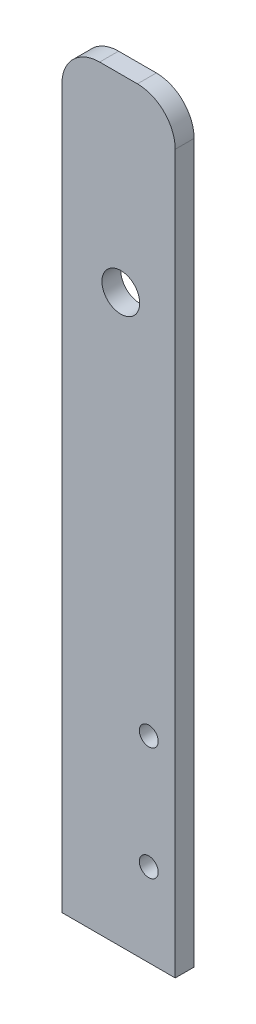
ISO-10303-21;
HEADER;
FILE_DESCRIPTION(('STEP AP214'),'2;1');
FILE_NAME('part.step','',(''),(''),'','','');
FILE_SCHEMA(('AUTOMOTIVE_DESIGN { 1 0 10303 214 1 1 1 1 }'));
ENDSEC;
DATA;
#1=APPLICATION_CONTEXT('core data for automotive mechanical design processes');
#2=APPLICATION_PROTOCOL_DEFINITION('international standard','automotive_design',2000,#1);
#3=PRODUCT_CONTEXT('',#1,'mechanical');
#4=PRODUCT('Part','Part','',(#3));
#5=PRODUCT_RELATED_PRODUCT_CATEGORY('part','',(#4));
#6=PRODUCT_DEFINITION_FORMATION('','',#4);
#7=PRODUCT_DEFINITION_CONTEXT('part definition',#1,'design');
#8=PRODUCT_DEFINITION('design','',#6,#7);
#9=PRODUCT_DEFINITION_SHAPE('','',#8);
#10=(LENGTH_UNIT() NAMED_UNIT(*) SI_UNIT(.MILLI.,.METRE.));
#11=(NAMED_UNIT(*) PLANE_ANGLE_UNIT() SI_UNIT($,.RADIAN.));
#12=(NAMED_UNIT(*) SI_UNIT($,.STERADIAN.) SOLID_ANGLE_UNIT());
#13=UNCERTAINTY_MEASURE_WITH_UNIT(LENGTH_MEASURE(1.E-05),#10,'distance_accuracy_value','');
#14=(GEOMETRIC_REPRESENTATION_CONTEXT(3) GLOBAL_UNCERTAINTY_ASSIGNED_CONTEXT((#13)) GLOBAL_UNIT_ASSIGNED_CONTEXT((#10,
#11,#12)) REPRESENTATION_CONTEXT('',''));
#15=CARTESIAN_POINT('',(0.,0.,0.));
#16=DIRECTION('',(0.,0.,1.));
#17=DIRECTION('',(1.,0.,0.));
#18=AXIS2_PLACEMENT_3D('',#15,#16,#17);
#19=CARTESIAN_POINT('',(0.,254.,6.35));
#20=DIRECTION('',(1.,0.,0.));
#21=DIRECTION('',(0.,1.,0.));
#22=AXIS2_PLACEMENT_3D('',#19,#20,#21);
#23=PLANE('',#22);
#24=DIRECTION('',(0.,-1.,0.));
#25=VECTOR('',#24,1.);
#26=CARTESIAN_POINT('',(0.,254.,6.35));
#27=LINE('',#26,#25);
#28=CARTESIAN_POINT('',(0.,241.3,6.35));
#29=VERTEX_POINT('',#28);
#30=CARTESIAN_POINT('',(0.,0.,6.35));
#31=VERTEX_POINT('',#30);
#32=EDGE_CURVE('E95',#29,#31,#27,.T.);
#33=ORIENTED_EDGE('',*,*,#32,.F.);
#34=DIRECTION('',(0.,0.,-1.));
#35=VECTOR('',#34,1.);
#36=CARTESIAN_POINT('',(0.,241.3,6.35));
#37=LINE('',#36,#35);
#38=CARTESIAN_POINT('',(0.,241.3,0.));
#39=VERTEX_POINT('',#38);
#40=EDGE_CURVE('E142',#29,#39,#37,.T.);
#41=ORIENTED_EDGE('',*,*,#40,.T.);
#42=DIRECTION('',(0.,-1.,0.));
#43=VECTOR('',#42,1.);
#44=CARTESIAN_POINT('',(0.,254.,0.));
#45=LINE('',#44,#43);
#46=CARTESIAN_POINT('',(0.,0.,0.));
#47=VERTEX_POINT('',#46);
#48=EDGE_CURVE('E119',#39,#47,#45,.T.);
#49=ORIENTED_EDGE('',*,*,#48,.T.);
#50=DIRECTION('',(0.,0.,-1.));
#51=VECTOR('',#50,1.);
#52=CARTESIAN_POINT('',(0.,0.,6.35));
#53=LINE('',#52,#51);
#54=EDGE_CURVE('E112',#31,#47,#53,.T.);
#55=ORIENTED_EDGE('',*,*,#54,.F.);
#56=EDGE_LOOP('',(#33,#41,#49,#55));
#57=FACE_BOUND('',#56,.T.);
#58=ADVANCED_FACE('F42',(#57),#23,.F.);
#59=CARTESIAN_POINT('',(0.,0.,6.35));
#60=DIRECTION('',(0.,1.,0.));
#61=DIRECTION('',(0.,0.,1.));
#62=AXIS2_PLACEMENT_3D('',#59,#60,#61);
#63=PLANE('',#62);
#64=DIRECTION('',(1.,0.,0.));
#65=VECTOR('',#64,1.);
#66=CARTESIAN_POINT('',(0.,0.,0.));
#67=LINE('',#66,#65);
#68=CARTESIAN_POINT('',(38.1,0.,0.));
#69=VERTEX_POINT('',#68);
#70=EDGE_CURVE('E158',#47,#69,#67,.T.);
#71=ORIENTED_EDGE('',*,*,#70,.T.);
#72=DIRECTION('',(0.,0.,-1.));
#73=VECTOR('',#72,1.);
#74=CARTESIAN_POINT('',(38.1,0.,6.35));
#75=LINE('',#74,#73);
#76=CARTESIAN_POINT('',(38.1,0.,6.35));
#77=VERTEX_POINT('',#76);
#78=EDGE_CURVE('E114',#77,#69,#75,.T.);
#79=ORIENTED_EDGE('',*,*,#78,.F.);
#80=DIRECTION('',(1.,0.,0.));
#81=VECTOR('',#80,1.);
#82=CARTESIAN_POINT('',(0.,0.,6.35));
#83=LINE('',#82,#81);
#84=EDGE_CURVE('E99',#31,#77,#83,.T.);
#85=ORIENTED_EDGE('',*,*,#84,.F.);
#86=ORIENTED_EDGE('',*,*,#54,.T.);
#87=EDGE_LOOP('',(#71,#79,#85,#86));
#88=FACE_BOUND('',#87,.T.);
#89=ADVANCED_FACE('F111',(#88),#63,.F.);
#90=CARTESIAN_POINT('',(38.1,254.,6.35));
#91=DIRECTION('',(-1.,0.,0.));
#92=DIRECTION('',(0.,0.,1.));
#93=AXIS2_PLACEMENT_3D('',#90,#91,#92);
#94=PLANE('',#93);
#95=DIRECTION('',(0.,1.,0.));
#96=VECTOR('',#95,1.);
#97=CARTESIAN_POINT('',(38.1,254.,0.));
#98=LINE('',#97,#96);
#99=CARTESIAN_POINT('',(38.1,241.3,0.));
#100=VERTEX_POINT('',#99);
#101=EDGE_CURVE('E165',#69,#100,#98,.T.);
#102=ORIENTED_EDGE('',*,*,#101,.T.);
#103=DIRECTION('',(0.,0.,-1.));
#104=VECTOR('',#103,1.);
#105=CARTESIAN_POINT('',(38.1,241.3,6.35));
#106=LINE('',#105,#104);
#107=CARTESIAN_POINT('',(38.1,241.3,6.35));
#108=VERTEX_POINT('',#107);
#109=EDGE_CURVE('E136',#100,#108,#106,.F.);
#110=ORIENTED_EDGE('',*,*,#109,.T.);
#111=DIRECTION('',(0.,1.,0.));
#112=VECTOR('',#111,1.);
#113=CARTESIAN_POINT('',(38.1,254.,6.35));
#114=LINE('',#113,#112);
#115=EDGE_CURVE('E117',#77,#108,#114,.T.);
#116=ORIENTED_EDGE('',*,*,#115,.F.);
#117=ORIENTED_EDGE('',*,*,#78,.T.);
#118=EDGE_LOOP('',(#102,#110,#116,#117));
#119=FACE_BOUND('',#118,.T.);
#120=ADVANCED_FACE('F195',(#119),#94,.F.);
#121=CARTESIAN_POINT('',(0.,254.,6.35));
#122=DIRECTION('',(0.,-1.,0.));
#123=DIRECTION('',(0.,0.,-1.));
#124=AXIS2_PLACEMENT_3D('',#121,#122,#123);
#125=PLANE('',#124);
#126=DIRECTION('',(-1.,0.,0.));
#127=VECTOR('',#126,1.);
#128=CARTESIAN_POINT('',(0.,254.,0.));
#129=LINE('',#128,#127);
#130=CARTESIAN_POINT('',(25.4,254.,0.));
#131=VERTEX_POINT('',#130);
#132=CARTESIAN_POINT('',(12.6999999999999,254.,0.));
#133=VERTEX_POINT('',#132);
#134=EDGE_CURVE('E107',#131,#133,#129,.T.);
#135=ORIENTED_EDGE('',*,*,#134,.T.);
#136=DIRECTION('',(0.,0.,-1.));
#137=VECTOR('',#136,1.);
#138=CARTESIAN_POINT('',(12.6999999999999,254.,6.35));
#139=LINE('',#138,#137);
#140=CARTESIAN_POINT('',(12.6999999999999,254.,6.35));
#141=VERTEX_POINT('',#140);
#142=EDGE_CURVE('E51',#133,#141,#139,.F.);
#143=ORIENTED_EDGE('',*,*,#142,.T.);
#144=DIRECTION('',(-1.,0.,0.));
#145=VECTOR('',#144,1.);
#146=CARTESIAN_POINT('',(0.,254.,6.35));
#147=LINE('',#146,#145);
#148=CARTESIAN_POINT('',(25.4,254.,6.35));
#149=VERTEX_POINT('',#148);
#150=EDGE_CURVE('E130',#149,#141,#147,.T.);
#151=ORIENTED_EDGE('',*,*,#150,.F.);
#152=DIRECTION('',(0.,0.,-1.));
#153=VECTOR('',#152,1.);
#154=CARTESIAN_POINT('',(25.4,254.,6.35));
#155=LINE('',#154,#153);
#156=EDGE_CURVE('E122',#149,#131,#155,.T.);
#157=ORIENTED_EDGE('',*,*,#156,.T.);
#158=EDGE_LOOP('',(#135,#143,#151,#157));
#159=FACE_BOUND('',#158,.T.);
#160=ADVANCED_FACE('F177',(#159),#125,.F.);
#161=CARTESIAN_POINT('',(0.,0.,6.35));
#162=DIRECTION('',(0.,0.,1.));
#163=DIRECTION('',(1.,0.,0.));
#164=AXIS2_PLACEMENT_3D('',#161,#162,#163);
#165=PLANE('',#164);
#166=CARTESIAN_POINT('',(29.21,27.94,6.35));
#167=DIRECTION('',(0.,0.,1.));
#168=DIRECTION('',(1.,0.,0.));
#169=AXIS2_PLACEMENT_3D('',#166,#167,#168);
#170=CIRCLE('',#169,3.175);
#171=CARTESIAN_POINT('',(32.385,27.94,6.35));
#172=VERTEX_POINT('',#171);
#173=EDGE_CURVE('E168',#172,#172,#170,.T.);
#174=ORIENTED_EDGE('',*,*,#173,.F.);
#175=EDGE_LOOP('',(#174));
#176=FACE_BOUND('',#175,.T.);
#177=CARTESIAN_POINT('',(29.21,66.04,6.35));
#178=DIRECTION('',(0.,0.,1.));
#179=DIRECTION('',(1.,0.,0.));
#180=AXIS2_PLACEMENT_3D('',#177,#178,#179);
#181=CIRCLE('',#180,3.175);
#182=CARTESIAN_POINT('',(32.385,66.04,6.35));
#183=VERTEX_POINT('',#182);
#184=EDGE_CURVE('E227',#183,#183,#181,.T.);
#185=ORIENTED_EDGE('',*,*,#184,.F.);
#186=EDGE_LOOP('',(#185));
#187=FACE_BOUND('',#186,.T.);
#188=CARTESIAN_POINT('',(19.812,190.5,6.35));
#189=DIRECTION('',(0.,0.,1.));
#190=DIRECTION('',(1.,0.,0.));
#191=AXIS2_PLACEMENT_3D('',#188,#189,#190);
#192=CIRCLE('',#191,6.35);
#193=CARTESIAN_POINT('',(26.162,190.5,6.35));
#194=VERTEX_POINT('',#193);
#195=EDGE_CURVE('E237',#194,#194,#192,.T.);
#196=ORIENTED_EDGE('',*,*,#195,.F.);
#197=EDGE_LOOP('',(#196));
#198=FACE_BOUND('',#197,.T.);
#199=ORIENTED_EDGE('',*,*,#150,.T.);
#200=CARTESIAN_POINT('',(12.6999999999999,241.3,6.35));
#201=DIRECTION('',(0.,0.,1.));
#202=DIRECTION('',(1.,0.,0.));
#203=AXIS2_PLACEMENT_3D('',#200,#201,#202);
#204=CIRCLE('',#203,12.7);
#205=EDGE_CURVE('E11',#141,#29,#204,.T.);
#206=ORIENTED_EDGE('',*,*,#205,.T.);
#207=ORIENTED_EDGE('',*,*,#32,.T.);
#208=ORIENTED_EDGE('',*,*,#84,.T.);
#209=ORIENTED_EDGE('',*,*,#115,.T.);
#210=CARTESIAN_POINT('',(25.4,241.3,6.35));
#211=DIRECTION('',(0.,0.,1.));
#212=DIRECTION('',(1.,0.,0.));
#213=AXIS2_PLACEMENT_3D('',#210,#211,#212);
#214=CIRCLE('',#213,12.7);
#215=EDGE_CURVE('E139',#108,#149,#214,.T.);
#216=ORIENTED_EDGE('',*,*,#215,.T.);
#217=EDGE_LOOP('',(#199,#206,#207,#208,#209,#216));
#218=FACE_BOUND('',#217,.T.);
#219=ADVANCED_FACE('F97',(#176,#187,#198,#218),#165,.T.);
#220=CARTESIAN_POINT('',(0.,0.,0.));
#221=DIRECTION('',(0.,0.,1.));
#222=DIRECTION('',(1.,0.,0.));
#223=AXIS2_PLACEMENT_3D('',#220,#221,#222);
#224=PLANE('',#223);
#225=CARTESIAN_POINT('',(29.21,27.94,0.));
#226=DIRECTION('',(0.,0.,1.));
#227=DIRECTION('',(1.,0.,0.));
#228=AXIS2_PLACEMENT_3D('',#225,#226,#227);
#229=CIRCLE('',#228,3.175);
#230=CARTESIAN_POINT('',(32.385,27.94,0.));
#231=VERTEX_POINT('',#230);
#232=EDGE_CURVE('E160',#231,#231,#229,.T.);
#233=ORIENTED_EDGE('',*,*,#232,.T.);
#234=EDGE_LOOP('',(#233));
#235=FACE_BOUND('',#234,.T.);
#236=CARTESIAN_POINT('',(29.21,66.04,0.));
#237=DIRECTION('',(0.,0.,1.));
#238=DIRECTION('',(1.,0.,0.));
#239=AXIS2_PLACEMENT_3D('',#236,#237,#238);
#240=CIRCLE('',#239,3.175);
#241=CARTESIAN_POINT('',(32.385,66.04,0.));
#242=VERTEX_POINT('',#241);
#243=EDGE_CURVE('E222',#242,#242,#240,.T.);
#244=ORIENTED_EDGE('',*,*,#243,.T.);
#245=EDGE_LOOP('',(#244));
#246=FACE_BOUND('',#245,.T.);
#247=CARTESIAN_POINT('',(19.812,190.5,0.));
#248=DIRECTION('',(0.,0.,1.));
#249=DIRECTION('',(1.,0.,0.));
#250=AXIS2_PLACEMENT_3D('',#247,#248,#249);
#251=CIRCLE('',#250,6.35);
#252=CARTESIAN_POINT('',(26.162,190.5,0.));
#253=VERTEX_POINT('',#252);
#254=EDGE_CURVE('E233',#253,#253,#251,.T.);
#255=ORIENTED_EDGE('',*,*,#254,.T.);
#256=EDGE_LOOP('',(#255));
#257=FACE_BOUND('',#256,.T.);
#258=ORIENTED_EDGE('',*,*,#48,.F.);
#259=CARTESIAN_POINT('',(12.6999999999999,241.3,0.));
#260=DIRECTION('',(0.,0.,1.));
#261=DIRECTION('',(1.,0.,0.));
#262=AXIS2_PLACEMENT_3D('',#259,#260,#261);
#263=CIRCLE('',#262,12.7);
#264=EDGE_CURVE('E65',#39,#133,#263,.F.);
#265=ORIENTED_EDGE('',*,*,#264,.T.);
#266=ORIENTED_EDGE('',*,*,#134,.F.);
#267=CARTESIAN_POINT('',(25.4,241.3,0.));
#268=DIRECTION('',(0.,0.,1.));
#269=DIRECTION('',(1.,0.,0.));
#270=AXIS2_PLACEMENT_3D('',#267,#268,#269);
#271=CIRCLE('',#270,12.7);
#272=EDGE_CURVE('E128',#131,#100,#271,.F.);
#273=ORIENTED_EDGE('',*,*,#272,.T.);
#274=ORIENTED_EDGE('',*,*,#101,.F.);
#275=ORIENTED_EDGE('',*,*,#70,.F.);
#276=EDGE_LOOP('',(#258,#265,#266,#273,#274,#275));
#277=FACE_BOUND('',#276,.T.);
#278=ADVANCED_FACE('F156',(#235,#246,#257,#277),#224,.F.);
#279=CARTESIAN_POINT('',(25.4,241.3,6.35));
#280=DIRECTION('',(0.,0.,-1.));
#281=DIRECTION('',(-1.,0.,0.));
#282=AXIS2_PLACEMENT_3D('',#279,#280,#281);
#283=CYLINDRICAL_SURFACE('',#282,12.7);
#284=ORIENTED_EDGE('',*,*,#215,.F.);
#285=ORIENTED_EDGE('',*,*,#109,.F.);
#286=ORIENTED_EDGE('',*,*,#272,.F.);
#287=ORIENTED_EDGE('',*,*,#156,.F.);
#288=EDGE_LOOP('',(#284,#285,#286,#287));
#289=FACE_BOUND('',#288,.T.);
#290=ADVANCED_FACE('F181',(#289),#283,.T.);
#291=CARTESIAN_POINT('',(12.6999999999999,241.3,6.35));
#292=DIRECTION('',(0.,0.,-1.));
#293=DIRECTION('',(-1.,0.,0.));
#294=AXIS2_PLACEMENT_3D('',#291,#292,#293);
#295=CYLINDRICAL_SURFACE('',#294,12.7);
#296=ORIENTED_EDGE('',*,*,#205,.F.);
#297=ORIENTED_EDGE('',*,*,#142,.F.);
#298=ORIENTED_EDGE('',*,*,#264,.F.);
#299=ORIENTED_EDGE('',*,*,#40,.F.);
#300=EDGE_LOOP('',(#296,#297,#298,#299));
#301=FACE_BOUND('',#300,.T.);
#302=ADVANCED_FACE('F44',(#301),#295,.T.);
#303=CARTESIAN_POINT('',(19.812,190.5,0.));
#304=DIRECTION('',(0.,0.,1.));
#305=DIRECTION('',(1.,0.,0.));
#306=AXIS2_PLACEMENT_3D('',#303,#304,#305);
#307=CYLINDRICAL_SURFACE('',#306,6.35);
#308=ORIENTED_EDGE('',*,*,#254,.F.);
#309=EDGE_LOOP('',(#308));
#310=FACE_BOUND('',#309,.T.);
#311=ORIENTED_EDGE('',*,*,#195,.T.);
#312=EDGE_LOOP('',(#311));
#313=FACE_BOUND('',#312,.T.);
#314=ADVANCED_FACE('F180',(#310,#313),#307,.F.);
#315=CARTESIAN_POINT('',(29.21,66.04,0.));
#316=DIRECTION('',(0.,0.,1.));
#317=DIRECTION('',(1.,0.,0.));
#318=AXIS2_PLACEMENT_3D('',#315,#316,#317);
#319=CYLINDRICAL_SURFACE('',#318,3.175);
#320=ORIENTED_EDGE('',*,*,#243,.F.);
#321=EDGE_LOOP('',(#320));
#322=FACE_BOUND('',#321,.T.);
#323=ORIENTED_EDGE('',*,*,#184,.T.);
#324=EDGE_LOOP('',(#323));
#325=FACE_BOUND('',#324,.T.);
#326=ADVANCED_FACE('F186',(#322,#325),#319,.F.);
#327=CARTESIAN_POINT('',(29.21,27.94,0.));
#328=DIRECTION('',(0.,0.,1.));
#329=DIRECTION('',(1.,0.,0.));
#330=AXIS2_PLACEMENT_3D('',#327,#328,#329);
#331=CYLINDRICAL_SURFACE('',#330,3.175);
#332=ORIENTED_EDGE('',*,*,#232,.F.);
#333=EDGE_LOOP('',(#332));
#334=FACE_BOUND('',#333,.T.);
#335=ORIENTED_EDGE('',*,*,#173,.T.);
#336=EDGE_LOOP('',(#335));
#337=FACE_BOUND('',#336,.T.);
#338=ADVANCED_FACE('F211',(#334,#337),#331,.F.);
#339=CLOSED_SHELL('',(#58,#89,#120,#160,#219,#278,#290,#302,#314,#326,#338));
#340=MANIFOLD_SOLID_BREP('B2',#339);
#341=ADVANCED_BREP_SHAPE_REPRESENTATION('',(#18,#340),#14);
#342=SHAPE_DEFINITION_REPRESENTATION(#9,#341);
ENDSEC;
END-ISO-10303-21;
